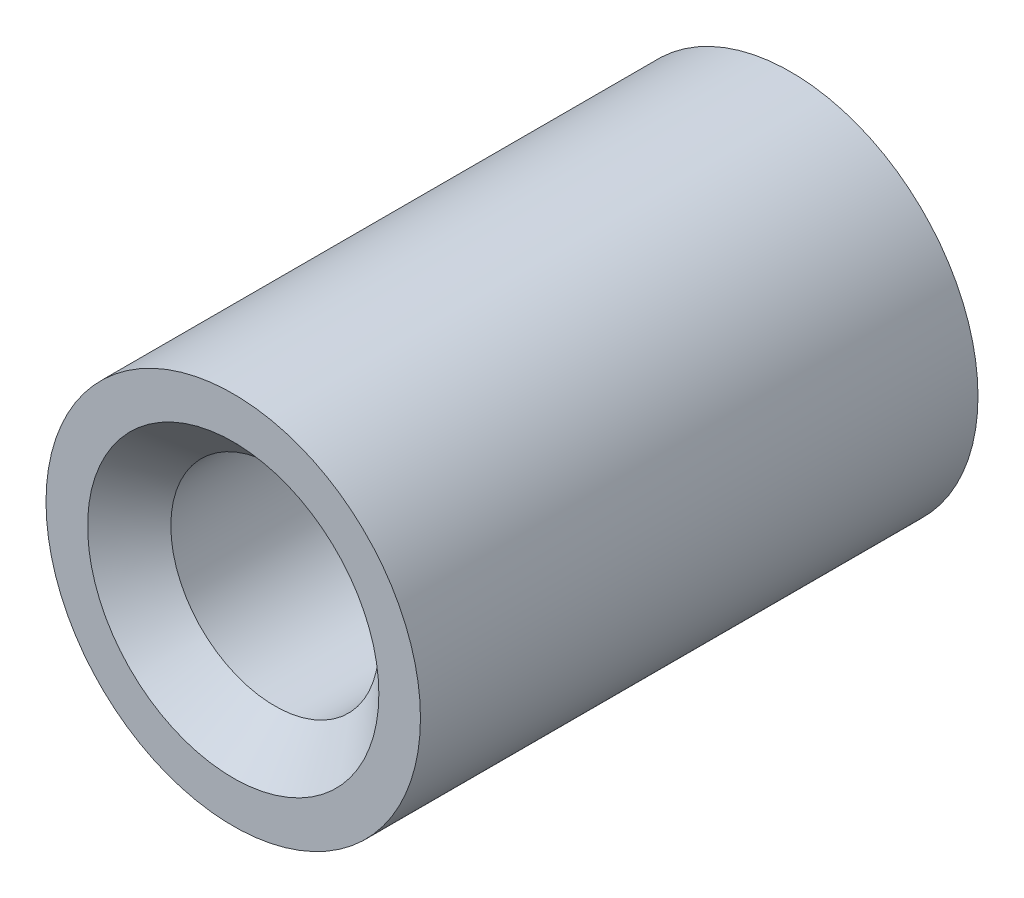
ISO-10303-21;
HEADER;
FILE_DESCRIPTION(('STEP AP214'),'2;1');
FILE_NAME('part.step','',(''),(''),'','','');
FILE_SCHEMA(('AUTOMOTIVE_DESIGN { 1 0 10303 214 1 1 1 1 }'));
ENDSEC;
DATA;
#1=APPLICATION_CONTEXT('core data for automotive mechanical design processes');
#2=APPLICATION_PROTOCOL_DEFINITION('international standard','automotive_design',2000,#1);
#3=PRODUCT_CONTEXT('',#1,'mechanical');
#4=PRODUCT('Part','Part','',(#3));
#5=PRODUCT_RELATED_PRODUCT_CATEGORY('part','',(#4));
#6=PRODUCT_DEFINITION_FORMATION('','',#4);
#7=PRODUCT_DEFINITION_CONTEXT('part definition',#1,'design');
#8=PRODUCT_DEFINITION('design','',#6,#7);
#9=PRODUCT_DEFINITION_SHAPE('','',#8);
#10=(LENGTH_UNIT() NAMED_UNIT(*) SI_UNIT(.MILLI.,.METRE.));
#11=(NAMED_UNIT(*) PLANE_ANGLE_UNIT() SI_UNIT($,.RADIAN.));
#12=(NAMED_UNIT(*) SI_UNIT($,.STERADIAN.) SOLID_ANGLE_UNIT());
#13=UNCERTAINTY_MEASURE_WITH_UNIT(LENGTH_MEASURE(1.E-05),#10,'distance_accuracy_value','');
#14=(GEOMETRIC_REPRESENTATION_CONTEXT(3) GLOBAL_UNCERTAINTY_ASSIGNED_CONTEXT((#13)) GLOBAL_UNIT_ASSIGNED_CONTEXT((#10,
#11,#12)) REPRESENTATION_CONTEXT('',''));
#15=CARTESIAN_POINT('',(0.,0.,0.));
#16=DIRECTION('',(0.,0.,1.));
#17=DIRECTION('',(1.,0.,0.));
#18=AXIS2_PLACEMENT_3D('',#15,#16,#17);
#19=CARTESIAN_POINT('',(-19.26,-16.34,25.2));
#20=DIRECTION('',(0.,0.,1.));
#21=DIRECTION('',(1.,0.,0.));
#22=AXIS2_PLACEMENT_3D('',#19,#20,#21);
#23=CONICAL_SURFACE('',#22,1.75,0.785398163397452);
#24=CARTESIAN_POINT('',(-19.26,-16.34,24.7));
#25=DIRECTION('',(0.,0.,1.));
#26=DIRECTION('',(1.,0.,0.));
#27=AXIS2_PLACEMENT_3D('',#24,#25,#26);
#28=CIRCLE('',#27,1.25);
#29=CARTESIAN_POINT('',(-18.01,-16.34,24.7));
#30=VERTEX_POINT('',#29);
#31=EDGE_CURVE('E10',#30,#30,#28,.T.);
#32=ORIENTED_EDGE('',*,*,#31,.F.);
#33=EDGE_LOOP('',(#32));
#34=FACE_BOUND('',#33,.T.);
#35=CARTESIAN_POINT('',(-19.26,-16.34,25.2));
#36=DIRECTION('',(0.,0.,1.));
#37=DIRECTION('',(1.,0.,0.));
#38=AXIS2_PLACEMENT_3D('',#35,#36,#37);
#39=CIRCLE('',#38,1.75);
#40=CARTESIAN_POINT('',(-17.51,-16.34,25.2));
#41=VERTEX_POINT('',#40);
#42=EDGE_CURVE('E39',#41,#41,#39,.T.);
#43=ORIENTED_EDGE('',*,*,#42,.T.);
#44=EDGE_LOOP('',(#43));
#45=FACE_BOUND('',#44,.T.);
#46=ADVANCED_FACE('F15',(#34,#45),#23,.F.);
#47=CARTESIAN_POINT('',(-19.26,-16.34,25.2));
#48=DIRECTION('',(0.,0.,1.));
#49=DIRECTION('',(1.,0.,0.));
#50=AXIS2_PLACEMENT_3D('',#47,#48,#49);
#51=CYLINDRICAL_SURFACE('',#50,1.25);
#52=CARTESIAN_POINT('',(-19.26,-16.34,18.5));
#53=DIRECTION('',(0.,0.,1.));
#54=DIRECTION('',(1.,0.,0.));
#55=AXIS2_PLACEMENT_3D('',#52,#53,#54);
#56=CIRCLE('',#55,1.25);
#57=CARTESIAN_POINT('',(-18.01,-16.34,18.5));
#58=VERTEX_POINT('',#57);
#59=EDGE_CURVE('E33',#58,#58,#56,.T.);
#60=ORIENTED_EDGE('',*,*,#59,.F.);
#61=EDGE_LOOP('',(#60));
#62=FACE_BOUND('',#61,.T.);
#63=ORIENTED_EDGE('',*,*,#31,.T.);
#64=EDGE_LOOP('',(#63));
#65=FACE_BOUND('',#64,.T.);
#66=ADVANCED_FACE('F17',(#62,#65),#51,.F.);
#67=CARTESIAN_POINT('',(-19.26,-16.34,31.5639610306789));
#68=DIRECTION('',(0.,0.,-1.));
#69=DIRECTION('',(-1.,0.,0.));
#70=AXIS2_PLACEMENT_3D('',#67,#68,#69);
#71=CYLINDRICAL_SURFACE('',#70,2.25);
#72=CARTESIAN_POINT('',(-19.26,-16.34,18.5));
#73=DIRECTION('',(0.,0.,1.));
#74=DIRECTION('',(1.,0.,0.));
#75=AXIS2_PLACEMENT_3D('',#72,#73,#74);
#76=CIRCLE('',#75,2.25);
#77=CARTESIAN_POINT('',(-17.01,-16.34,18.5));
#78=VERTEX_POINT('',#77);
#79=EDGE_CURVE('E19',#78,#78,#76,.T.);
#80=ORIENTED_EDGE('',*,*,#79,.T.);
#81=EDGE_LOOP('',(#80));
#82=FACE_BOUND('',#81,.T.);
#83=CARTESIAN_POINT('',(-19.26,-16.34,25.2));
#84=DIRECTION('',(0.,0.,1.));
#85=DIRECTION('',(1.,0.,0.));
#86=AXIS2_PLACEMENT_3D('',#83,#84,#85);
#87=CIRCLE('',#86,2.25);
#88=CARTESIAN_POINT('',(-17.01,-16.34,25.2));
#89=VERTEX_POINT('',#88);
#90=EDGE_CURVE('E38',#89,#89,#87,.T.);
#91=ORIENTED_EDGE('',*,*,#90,.F.);
#92=EDGE_LOOP('',(#91));
#93=FACE_BOUND('',#92,.T.);
#94=ADVANCED_FACE('F51',(#82,#93),#71,.T.);
#95=CARTESIAN_POINT('',(-19.26,-16.34,18.5));
#96=DIRECTION('',(0.,0.,1.));
#97=DIRECTION('',(1.,0.,0.));
#98=AXIS2_PLACEMENT_3D('',#95,#96,#97);
#99=PLANE('',#98);
#100=ORIENTED_EDGE('',*,*,#79,.F.);
#101=EDGE_LOOP('',(#100));
#102=FACE_BOUND('',#101,.T.);
#103=ORIENTED_EDGE('',*,*,#59,.T.);
#104=EDGE_LOOP('',(#103));
#105=FACE_BOUND('',#104,.T.);
#106=ADVANCED_FACE('F53',(#102,#105),#99,.F.);
#107=CARTESIAN_POINT('',(17.14,14.66,25.2));
#108=DIRECTION('',(0.,0.,1.));
#109=DIRECTION('',(1.,0.,0.));
#110=AXIS2_PLACEMENT_3D('',#107,#108,#109);
#111=PLANE('',#110);
#112=ORIENTED_EDGE('',*,*,#90,.T.);
#113=EDGE_LOOP('',(#112));
#114=FACE_BOUND('',#113,.T.);
#115=ORIENTED_EDGE('',*,*,#42,.F.);
#116=EDGE_LOOP('',(#115));
#117=FACE_BOUND('',#116,.T.);
#118=ADVANCED_FACE('F48',(#114,#117),#111,.T.);
#119=CLOSED_SHELL('',(#46,#66,#94,#106,#118));
#120=MANIFOLD_SOLID_BREP('B1',#119);
#121=ADVANCED_BREP_SHAPE_REPRESENTATION('',(#18,#120),#14);
#122=SHAPE_DEFINITION_REPRESENTATION(#9,#121);
ENDSEC;
END-ISO-10303-21;
